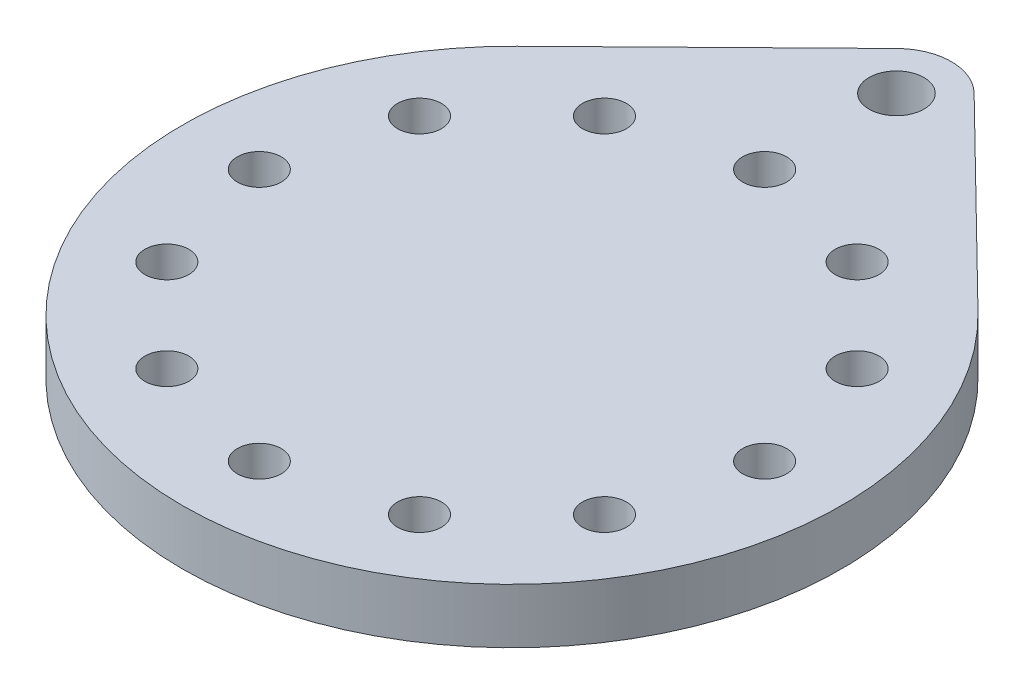
ISO-10303-21;
HEADER;
FILE_DESCRIPTION(('STEP AP214'),'2;1');
FILE_NAME('part.step','',(''),(''),'','','');
FILE_SCHEMA(('AUTOMOTIVE_DESIGN { 1 0 10303 214 1 1 1 1 }'));
ENDSEC;
DATA;
#1=APPLICATION_CONTEXT('core data for automotive mechanical design processes');
#2=APPLICATION_PROTOCOL_DEFINITION('international standard','automotive_design',2000,#1);
#3=PRODUCT_CONTEXT('',#1,'mechanical');
#4=PRODUCT('Part','Part','',(#3));
#5=PRODUCT_RELATED_PRODUCT_CATEGORY('part','',(#4));
#6=PRODUCT_DEFINITION_FORMATION('','',#4);
#7=PRODUCT_DEFINITION_CONTEXT('part definition',#1,'design');
#8=PRODUCT_DEFINITION('design','',#6,#7);
#9=PRODUCT_DEFINITION_SHAPE('','',#8);
#10=(LENGTH_UNIT() NAMED_UNIT(*) SI_UNIT(.MILLI.,.METRE.));
#11=(NAMED_UNIT(*) PLANE_ANGLE_UNIT() SI_UNIT($,.RADIAN.));
#12=(NAMED_UNIT(*) SI_UNIT($,.STERADIAN.) SOLID_ANGLE_UNIT());
#13=UNCERTAINTY_MEASURE_WITH_UNIT(LENGTH_MEASURE(1.E-05),#10,'distance_accuracy_value','');
#14=(GEOMETRIC_REPRESENTATION_CONTEXT(3) GLOBAL_UNCERTAINTY_ASSIGNED_CONTEXT((#13)) GLOBAL_UNIT_ASSIGNED_CONTEXT((#10,
#11,#12)) REPRESENTATION_CONTEXT('',''));
#15=CARTESIAN_POINT('',(0.,0.,0.));
#16=DIRECTION('',(0.,0.,1.));
#17=DIRECTION('',(1.,0.,0.));
#18=AXIS2_PLACEMENT_3D('',#15,#16,#17);
#19=CARTESIAN_POINT('',(0.,5.,0.));
#20=DIRECTION('',(0.,-1.,0.));
#21=DIRECTION('',(0.,0.,-1.));
#22=AXIS2_PLACEMENT_3D('',#19,#20,#21);
#23=CYLINDRICAL_SURFACE('',#22,30.);
#24=CARTESIAN_POINT('',(0.,0.,0.));
#25=DIRECTION('',(0.,1.,0.));
#26=DIRECTION('',(0.,0.,1.));
#27=AXIS2_PLACEMENT_3D('',#24,#25,#26);
#28=CIRCLE('',#27,30.);
#29=CARTESIAN_POINT('',(-20.995626366713,0.,-21.4285714285714));
#30=VERTEX_POINT('',#29);
#31=CARTESIAN_POINT('',(20.995626366713,0.,-21.4285714285714));
#32=VERTEX_POINT('',#31);
#33=EDGE_CURVE('E143',#30,#32,#28,.T.);
#34=ORIENTED_EDGE('',*,*,#33,.T.);
#35=DIRECTION('',(0.,-1.,0.));
#36=VECTOR('',#35,1.);
#37=CARTESIAN_POINT('',(20.995626366713,5.,-21.4285714285714));
#38=LINE('',#37,#36);
#39=CARTESIAN_POINT('',(20.995626366713,5.,-21.4285714285714));
#40=VERTEX_POINT('',#39);
#41=EDGE_CURVE('E11',#40,#32,#38,.T.);
#42=ORIENTED_EDGE('',*,*,#41,.F.);
#43=CARTESIAN_POINT('',(0.,5.,0.));
#44=DIRECTION('',(0.,1.,0.));
#45=DIRECTION('',(0.,0.,1.));
#46=AXIS2_PLACEMENT_3D('',#43,#44,#45);
#47=CIRCLE('',#46,30.);
#48=CARTESIAN_POINT('',(-20.995626366713,5.,-21.4285714285714));
#49=VERTEX_POINT('',#48);
#50=EDGE_CURVE('E80',#49,#40,#47,.T.);
#51=ORIENTED_EDGE('',*,*,#50,.F.);
#52=DIRECTION('',(0.,-1.,0.));
#53=VECTOR('',#52,1.);
#54=CARTESIAN_POINT('',(-20.995626366713,5.,-21.4285714285714));
#55=LINE('',#54,#53);
#56=EDGE_CURVE('E106',#49,#30,#55,.T.);
#57=ORIENTED_EDGE('',*,*,#56,.T.);
#58=EDGE_LOOP('',(#34,#42,#51,#57));
#59=FACE_BOUND('',#58,.T.);
#60=ADVANCED_FACE('F37',(#59),#23,.T.);
#61=CARTESIAN_POINT('',(20.995626366713,5.,-21.4285714285714));
#62=DIRECTION('',(0.699854212223765,0.,-0.714285714285714));
#63=DIRECTION('',(-0.714285714285714,0.,-0.699854212223765));
#64=AXIS2_PLACEMENT_3D('',#61,#62,#63);
#65=PLANE('',#64);
#66=DIRECTION('',(0.714285714285714,0.,0.699854212223766));
#67=VECTOR('',#66,1.);
#68=CARTESIAN_POINT('',(20.995626366713,0.,-21.4285714285714));
#69=LINE('',#68,#67);
#70=CARTESIAN_POINT('',(3.49927106111883,0.,-38.5714285714286));
#71=VERTEX_POINT('',#70);
#72=EDGE_CURVE('E90',#71,#32,#69,.T.);
#73=ORIENTED_EDGE('',*,*,#72,.F.);
#74=DIRECTION('',(0.,-1.,0.));
#75=VECTOR('',#74,1.);
#76=CARTESIAN_POINT('',(3.49927106111883,5.,-38.5714285714286));
#77=LINE('',#76,#75);
#78=CARTESIAN_POINT('',(3.49927106111883,5.,-38.5714285714286));
#79=VERTEX_POINT('',#78);
#80=EDGE_CURVE('E46',#79,#71,#77,.T.);
#81=ORIENTED_EDGE('',*,*,#80,.F.);
#82=DIRECTION('',(0.714285714285714,0.,0.699854212223766));
#83=VECTOR('',#82,1.);
#84=CARTESIAN_POINT('',(20.995626366713,5.,-21.4285714285714));
#85=LINE('',#84,#83);
#86=EDGE_CURVE('E88',#79,#40,#85,.T.);
#87=ORIENTED_EDGE('',*,*,#86,.T.);
#88=ORIENTED_EDGE('',*,*,#41,.T.);
#89=EDGE_LOOP('',(#73,#81,#87,#88));
#90=FACE_BOUND('',#89,.T.);
#91=ADVANCED_FACE('F87',(#90),#65,.T.);
#92=CARTESIAN_POINT('',(0.,5.,-35.));
#93=DIRECTION('',(0.,-1.,0.));
#94=DIRECTION('',(0.,0.,-1.));
#95=AXIS2_PLACEMENT_3D('',#92,#93,#94);
#96=CYLINDRICAL_SURFACE('',#95,5.00000000000001);
#97=CARTESIAN_POINT('',(0.,0.,-35.));
#98=DIRECTION('',(0.,1.,0.));
#99=DIRECTION('',(0.,0.,1.));
#100=AXIS2_PLACEMENT_3D('',#97,#98,#99);
#101=CIRCLE('',#100,5.00000000000001);
#102=CARTESIAN_POINT('',(-3.49927106111883,0.,-38.5714285714286));
#103=VERTEX_POINT('',#102);
#104=EDGE_CURVE('E69',#71,#103,#101,.T.);
#105=ORIENTED_EDGE('',*,*,#104,.T.);
#106=DIRECTION('',(0.,-1.,0.));
#107=VECTOR('',#106,1.);
#108=CARTESIAN_POINT('',(-3.49927106111883,5.,-38.5714285714286));
#109=LINE('',#108,#107);
#110=CARTESIAN_POINT('',(-3.49927106111883,5.,-38.5714285714286));
#111=VERTEX_POINT('',#110);
#112=EDGE_CURVE('E91',#111,#103,#109,.T.);
#113=ORIENTED_EDGE('',*,*,#112,.F.);
#114=CARTESIAN_POINT('',(0.,5.,-35.));
#115=DIRECTION('',(0.,1.,0.));
#116=DIRECTION('',(0.,0.,1.));
#117=AXIS2_PLACEMENT_3D('',#114,#115,#116);
#118=CIRCLE('',#117,5.00000000000001);
#119=EDGE_CURVE('E92',#79,#111,#118,.T.);
#120=ORIENTED_EDGE('',*,*,#119,.F.);
#121=ORIENTED_EDGE('',*,*,#80,.T.);
#122=EDGE_LOOP('',(#105,#113,#120,#121));
#123=FACE_BOUND('',#122,.T.);
#124=ADVANCED_FACE('F93',(#123),#96,.T.);
#125=CARTESIAN_POINT('',(-20.995626366713,5.,-21.4285714285714));
#126=DIRECTION('',(0.699854212223765,0.,0.714285714285714));
#127=DIRECTION('',(0.714285714285714,0.,-0.699854212223765));
#128=AXIS2_PLACEMENT_3D('',#125,#126,#127);
#129=PLANE('',#128);
#130=DIRECTION('',(-0.714285714285714,0.,0.699854212223765));
#131=VECTOR('',#130,1.);
#132=CARTESIAN_POINT('',(-20.995626366713,0.,-21.4285714285714));
#133=LINE('',#132,#131);
#134=EDGE_CURVE('E75',#103,#30,#133,.T.);
#135=ORIENTED_EDGE('',*,*,#134,.T.);
#136=ORIENTED_EDGE('',*,*,#56,.F.);
#137=DIRECTION('',(-0.714285714285714,0.,0.699854212223765));
#138=VECTOR('',#137,1.);
#139=CARTESIAN_POINT('',(-20.995626366713,5.,-21.4285714285714));
#140=LINE('',#139,#138);
#141=EDGE_CURVE('E54',#111,#49,#140,.T.);
#142=ORIENTED_EDGE('',*,*,#141,.F.);
#143=ORIENTED_EDGE('',*,*,#112,.T.);
#144=EDGE_LOOP('',(#135,#136,#142,#143));
#145=FACE_BOUND('',#144,.T.);
#146=ADVANCED_FACE('F154',(#145),#129,.F.);
#147=CARTESIAN_POINT('',(0.,5.,-23.));
#148=DIRECTION('',(0.,-1.,0.));
#149=DIRECTION('',(0.,0.,-1.));
#150=AXIS2_PLACEMENT_3D('',#147,#148,#149);
#151=CYLINDRICAL_SURFACE('',#150,2.);
#152=CARTESIAN_POINT('',(0.,5.,-23.));
#153=DIRECTION('',(0.,1.,0.));
#154=DIRECTION('',(0.,0.,1.));
#155=AXIS2_PLACEMENT_3D('',#152,#153,#154);
#156=CIRCLE('',#155,2.);
#157=CARTESIAN_POINT('',(0.,5.,-21.));
#158=VERTEX_POINT('',#157);
#159=EDGE_CURVE('E98',#158,#158,#156,.T.);
#160=ORIENTED_EDGE('',*,*,#159,.T.);
#161=EDGE_LOOP('',(#160));
#162=FACE_BOUND('',#161,.T.);
#163=CARTESIAN_POINT('',(0.,0.,-23.));
#164=DIRECTION('',(0.,1.,0.));
#165=DIRECTION('',(0.,0.,1.));
#166=AXIS2_PLACEMENT_3D('',#163,#164,#165);
#167=CIRCLE('',#166,2.);
#168=CARTESIAN_POINT('',(0.,0.,-21.));
#169=VERTEX_POINT('',#168);
#170=EDGE_CURVE('E140',#169,#169,#167,.T.);
#171=ORIENTED_EDGE('',*,*,#170,.F.);
#172=EDGE_LOOP('',(#171));
#173=FACE_BOUND('',#172,.T.);
#174=ADVANCED_FACE('F168',(#162,#173),#151,.F.);
#175=CARTESIAN_POINT('',(11.5,5.,-19.9185842870421));
#176=DIRECTION('',(0.,-1.,0.));
#177=DIRECTION('',(0.,0.,-1.));
#178=AXIS2_PLACEMENT_3D('',#175,#176,#177);
#179=CYLINDRICAL_SURFACE('',#178,2.);
#180=CARTESIAN_POINT('',(11.5,5.,-19.9185842870421));
#181=DIRECTION('',(0.,1.,0.));
#182=DIRECTION('',(0.,0.,1.));
#183=AXIS2_PLACEMENT_3D('',#180,#181,#182);
#184=CIRCLE('',#183,2.);
#185=CARTESIAN_POINT('',(11.5,5.,-17.9185842870421));
#186=VERTEX_POINT('',#185);
#187=EDGE_CURVE('E435',#186,#186,#184,.T.);
#188=ORIENTED_EDGE('',*,*,#187,.T.);
#189=EDGE_LOOP('',(#188));
#190=FACE_BOUND('',#189,.T.);
#191=CARTESIAN_POINT('',(11.5,0.,-19.9185842870421));
#192=DIRECTION('',(0.,1.,0.));
#193=DIRECTION('',(0.,0.,1.));
#194=AXIS2_PLACEMENT_3D('',#191,#192,#193);
#195=CIRCLE('',#194,2.);
#196=CARTESIAN_POINT('',(11.5,0.,-17.9185842870421));
#197=VERTEX_POINT('',#196);
#198=EDGE_CURVE('E137',#197,#197,#195,.T.);
#199=ORIENTED_EDGE('',*,*,#198,.F.);
#200=EDGE_LOOP('',(#199));
#201=FACE_BOUND('',#200,.T.);
#202=ADVANCED_FACE('F171',(#190,#201),#179,.F.);
#203=CARTESIAN_POINT('',(19.9185842870426,5.,-11.5000000000008));
#204=DIRECTION('',(0.,-1.,0.));
#205=DIRECTION('',(0.,0.,-1.));
#206=AXIS2_PLACEMENT_3D('',#203,#204,#205);
#207=CYLINDRICAL_SURFACE('',#206,2.00000000000027);
#208=CARTESIAN_POINT('',(19.9185842870426,5.,-11.5000000000008));
#209=DIRECTION('',(0.,1.,0.));
#210=DIRECTION('',(0.,0.,1.));
#211=AXIS2_PLACEMENT_3D('',#208,#209,#210);
#212=CIRCLE('',#211,2.00000000000027);
#213=CARTESIAN_POINT('',(19.9185842870426,5.,-9.50000000000058));
#214=VERTEX_POINT('',#213);
#215=EDGE_CURVE('E431',#214,#214,#212,.T.);
#216=ORIENTED_EDGE('',*,*,#215,.T.);
#217=EDGE_LOOP('',(#216));
#218=FACE_BOUND('',#217,.T.);
#219=CARTESIAN_POINT('',(19.9185842870426,0.,-11.5000000000008));
#220=DIRECTION('',(0.,1.,0.));
#221=DIRECTION('',(0.,0.,1.));
#222=AXIS2_PLACEMENT_3D('',#219,#220,#221);
#223=CIRCLE('',#222,2.00000000000027);
#224=CARTESIAN_POINT('',(19.9185842870426,0.,-9.50000000000058));
#225=VERTEX_POINT('',#224);
#226=EDGE_CURVE('E134',#225,#225,#223,.T.);
#227=ORIENTED_EDGE('',*,*,#226,.F.);
#228=EDGE_LOOP('',(#227));
#229=FACE_BOUND('',#228,.T.);
#230=ADVANCED_FACE('F175',(#218,#229),#207,.F.);
#231=CARTESIAN_POINT('',(23.000000000001,5.,-9.7632394389188E-13));
#232=DIRECTION('',(0.,-1.,0.));
#233=DIRECTION('',(0.,0.,-1.));
#234=AXIS2_PLACEMENT_3D('',#231,#232,#233);
#235=CYLINDRICAL_SURFACE('',#234,2.00000000000073);
#236=CARTESIAN_POINT('',(23.000000000001,5.,-9.7632394389188E-13));
#237=DIRECTION('',(0.,1.,0.));
#238=DIRECTION('',(0.,0.,1.));
#239=AXIS2_PLACEMENT_3D('',#236,#237,#238);
#240=CIRCLE('',#239,2.00000000000073);
#241=CARTESIAN_POINT('',(23.000000000001,5.,1.99999999999975));
#242=VERTEX_POINT('',#241);
#243=EDGE_CURVE('E427',#242,#242,#240,.T.);
#244=ORIENTED_EDGE('',*,*,#243,.T.);
#245=EDGE_LOOP('',(#244));
#246=FACE_BOUND('',#245,.T.);
#247=CARTESIAN_POINT('',(23.000000000001,0.,-9.7632394389188E-13));
#248=DIRECTION('',(0.,1.,0.));
#249=DIRECTION('',(0.,0.,1.));
#250=AXIS2_PLACEMENT_3D('',#247,#248,#249);
#251=CIRCLE('',#250,2.00000000000073);
#252=CARTESIAN_POINT('',(23.000000000001,0.,1.99999999999975));
#253=VERTEX_POINT('',#252);
#254=EDGE_CURVE('E131',#253,#253,#251,.T.);
#255=ORIENTED_EDGE('',*,*,#254,.F.);
#256=EDGE_LOOP('',(#255));
#257=FACE_BOUND('',#256,.T.);
#258=ADVANCED_FACE('F179',(#246,#257),#235,.F.);
#259=CARTESIAN_POINT('',(19.9185842870436,5.,11.4999999999992));
#260=DIRECTION('',(0.,-1.,0.));
#261=DIRECTION('',(0.,0.,-1.));
#262=AXIS2_PLACEMENT_3D('',#259,#260,#261);
#263=CYLINDRICAL_SURFACE('',#262,2.00000000000126);
#264=CARTESIAN_POINT('',(19.9185842870436,5.,11.4999999999992));
#265=DIRECTION('',(0.,1.,0.));
#266=DIRECTION('',(0.,0.,1.));
#267=AXIS2_PLACEMENT_3D('',#264,#265,#266);
#268=CIRCLE('',#267,2.00000000000126);
#269=CARTESIAN_POINT('',(19.9185842870436,5.,13.5000000000004));
#270=VERTEX_POINT('',#269);
#271=EDGE_CURVE('E423',#270,#270,#268,.T.);
#272=ORIENTED_EDGE('',*,*,#271,.T.);
#273=EDGE_LOOP('',(#272));
#274=FACE_BOUND('',#273,.T.);
#275=CARTESIAN_POINT('',(19.9185842870436,0.,11.4999999999992));
#276=DIRECTION('',(0.,1.,0.));
#277=DIRECTION('',(0.,0.,1.));
#278=AXIS2_PLACEMENT_3D('',#275,#276,#277);
#279=CIRCLE('',#278,2.00000000000126);
#280=CARTESIAN_POINT('',(19.9185842870436,0.,13.5000000000004));
#281=VERTEX_POINT('',#280);
#282=EDGE_CURVE('E128',#281,#281,#279,.T.);
#283=ORIENTED_EDGE('',*,*,#282,.F.);
#284=EDGE_LOOP('',(#283));
#285=FACE_BOUND('',#284,.T.);
#286=ADVANCED_FACE('F183',(#274,#285),#263,.F.);
#287=CARTESIAN_POINT('',(11.5000000000018,5.,19.9185842870416));
#288=DIRECTION('',(0.,-1.,0.));
#289=DIRECTION('',(0.,0.,-1.));
#290=AXIS2_PLACEMENT_3D('',#287,#288,#289);
#291=CYLINDRICAL_SURFACE('',#290,2.00000000000174);
#292=CARTESIAN_POINT('',(11.5000000000018,5.,19.9185842870416));
#293=DIRECTION('',(0.,1.,0.));
#294=DIRECTION('',(0.,0.,1.));
#295=AXIS2_PLACEMENT_3D('',#292,#293,#294);
#296=CIRCLE('',#295,2.00000000000174);
#297=CARTESIAN_POINT('',(11.5000000000018,5.,21.9185842870433));
#298=VERTEX_POINT('',#297);
#299=EDGE_CURVE('E419',#298,#298,#296,.T.);
#300=ORIENTED_EDGE('',*,*,#299,.T.);
#301=EDGE_LOOP('',(#300));
#302=FACE_BOUND('',#301,.T.);
#303=CARTESIAN_POINT('',(11.5000000000018,0.,19.9185842870416));
#304=DIRECTION('',(0.,1.,0.));
#305=DIRECTION('',(0.,0.,1.));
#306=AXIS2_PLACEMENT_3D('',#303,#304,#305);
#307=CIRCLE('',#306,2.00000000000174);
#308=CARTESIAN_POINT('',(11.5000000000018,0.,21.9185842870433));
#309=VERTEX_POINT('',#308);
#310=EDGE_CURVE('E125',#309,#309,#307,.T.);
#311=ORIENTED_EDGE('',*,*,#310,.F.);
#312=EDGE_LOOP('',(#311));
#313=FACE_BOUND('',#312,.T.);
#314=ADVANCED_FACE('F187',(#302,#313),#291,.F.);
#315=CARTESIAN_POINT('',(1.95264788778376E-12,5.,23.));
#316=DIRECTION('',(0.,-1.,0.));
#317=DIRECTION('',(0.,0.,-1.));
#318=AXIS2_PLACEMENT_3D('',#315,#316,#317);
#319=CYLINDRICAL_SURFACE('',#318,2.00000000000202);
#320=CARTESIAN_POINT('',(1.95264788778376E-12,5.,23.));
#321=DIRECTION('',(0.,1.,0.));
#322=DIRECTION('',(0.,0.,1.));
#323=AXIS2_PLACEMENT_3D('',#320,#321,#322);
#324=CIRCLE('',#323,2.00000000000202);
#325=CARTESIAN_POINT('',(1.95264788778376E-12,5.,25.000000000002));
#326=VERTEX_POINT('',#325);
#327=EDGE_CURVE('E415',#326,#326,#324,.T.);
#328=ORIENTED_EDGE('',*,*,#327,.T.);
#329=EDGE_LOOP('',(#328));
#330=FACE_BOUND('',#329,.T.);
#331=CARTESIAN_POINT('',(1.95264788778376E-12,0.,23.));
#332=DIRECTION('',(0.,1.,0.));
#333=DIRECTION('',(0.,0.,1.));
#334=AXIS2_PLACEMENT_3D('',#331,#332,#333);
#335=CIRCLE('',#334,2.00000000000202);
#336=CARTESIAN_POINT('',(1.95264788778376E-12,0.,25.000000000002));
#337=VERTEX_POINT('',#336);
#338=EDGE_CURVE('E122',#337,#337,#335,.T.);
#339=ORIENTED_EDGE('',*,*,#338,.F.);
#340=EDGE_LOOP('',(#339));
#341=FACE_BOUND('',#340,.T.);
#342=ADVANCED_FACE('F191',(#330,#341),#319,.F.);
#343=CARTESIAN_POINT('',(-11.4999999999982,5.,19.9185842870426));
#344=DIRECTION('',(0.,-1.,0.));
#345=DIRECTION('',(0.,0.,-1.));
#346=AXIS2_PLACEMENT_3D('',#343,#344,#345);
#347=CYLINDRICAL_SURFACE('',#346,2.00000000000207);
#348=CARTESIAN_POINT('',(-11.4999999999982,5.,19.9185842870426));
#349=DIRECTION('',(0.,1.,0.));
#350=DIRECTION('',(0.,0.,1.));
#351=AXIS2_PLACEMENT_3D('',#348,#349,#350);
#352=CIRCLE('',#351,2.00000000000207);
#353=CARTESIAN_POINT('',(-11.4999999999982,5.,21.9185842870447));
#354=VERTEX_POINT('',#353);
#355=EDGE_CURVE('E411',#354,#354,#352,.T.);
#356=ORIENTED_EDGE('',*,*,#355,.T.);
#357=EDGE_LOOP('',(#356));
#358=FACE_BOUND('',#357,.T.);
#359=CARTESIAN_POINT('',(-11.4999999999982,0.,19.9185842870426));
#360=DIRECTION('',(0.,1.,0.));
#361=DIRECTION('',(0.,0.,1.));
#362=AXIS2_PLACEMENT_3D('',#359,#360,#361);
#363=CIRCLE('',#362,2.00000000000207);
#364=CARTESIAN_POINT('',(-11.4999999999982,0.,21.9185842870447));
#365=VERTEX_POINT('',#364);
#366=EDGE_CURVE('E119',#365,#365,#363,.T.);
#367=ORIENTED_EDGE('',*,*,#366,.F.);
#368=EDGE_LOOP('',(#367));
#369=FACE_BOUND('',#368,.T.);
#370=ADVANCED_FACE('F195',(#358,#369),#347,.F.);
#371=CARTESIAN_POINT('',(-19.9185842870406,5.,11.5000000000009));
#372=DIRECTION('',(0.,-1.,0.));
#373=DIRECTION('',(0.,0.,-1.));
#374=AXIS2_PLACEMENT_3D('',#371,#372,#373);
#375=CYLINDRICAL_SURFACE('',#374,2.00000000000186);
#376=CARTESIAN_POINT('',(-19.9185842870406,5.,11.5000000000009));
#377=DIRECTION('',(0.,1.,0.));
#378=DIRECTION('',(0.,0.,1.));
#379=AXIS2_PLACEMENT_3D('',#376,#377,#378);
#380=CIRCLE('',#379,2.00000000000186);
#381=CARTESIAN_POINT('',(-19.9185842870406,5.,13.5000000000027));
#382=VERTEX_POINT('',#381);
#383=EDGE_CURVE('E407',#382,#382,#380,.T.);
#384=ORIENTED_EDGE('',*,*,#383,.T.);
#385=EDGE_LOOP('',(#384));
#386=FACE_BOUND('',#385,.T.);
#387=CARTESIAN_POINT('',(-19.9185842870406,0.,11.5000000000009));
#388=DIRECTION('',(0.,1.,0.));
#389=DIRECTION('',(0.,0.,1.));
#390=AXIS2_PLACEMENT_3D('',#387,#388,#389);
#391=CIRCLE('',#390,2.00000000000186);
#392=CARTESIAN_POINT('',(-19.9185842870406,0.,13.5000000000027));
#393=VERTEX_POINT('',#392);
#394=EDGE_CURVE('E116',#393,#393,#391,.T.);
#395=ORIENTED_EDGE('',*,*,#394,.F.);
#396=EDGE_LOOP('',(#395));
#397=FACE_BOUND('',#396,.T.);
#398=ADVANCED_FACE('F199',(#386,#397),#375,.F.);
#399=CARTESIAN_POINT('',(-22.999999999999,5.,9.79140631529919E-13));
#400=DIRECTION('',(0.,-1.,0.));
#401=DIRECTION('',(0.,0.,-1.));
#402=AXIS2_PLACEMENT_3D('',#399,#400,#401);
#403=CYLINDRICAL_SURFACE('',#402,2.00000000000145);
#404=CARTESIAN_POINT('',(-22.999999999999,5.,9.79140631529919E-13));
#405=DIRECTION('',(0.,1.,0.));
#406=DIRECTION('',(0.,0.,1.));
#407=AXIS2_PLACEMENT_3D('',#404,#405,#406);
#408=CIRCLE('',#407,2.00000000000145);
#409=CARTESIAN_POINT('',(-22.999999999999,5.,2.00000000000243));
#410=VERTEX_POINT('',#409);
#411=EDGE_CURVE('E403',#410,#410,#408,.T.);
#412=ORIENTED_EDGE('',*,*,#411,.T.);
#413=EDGE_LOOP('',(#412));
#414=FACE_BOUND('',#413,.T.);
#415=CARTESIAN_POINT('',(-22.999999999999,0.,9.79140631529919E-13));
#416=DIRECTION('',(0.,1.,0.));
#417=DIRECTION('',(0.,0.,1.));
#418=AXIS2_PLACEMENT_3D('',#415,#416,#417);
#419=CIRCLE('',#418,2.00000000000145);
#420=CARTESIAN_POINT('',(-22.999999999999,0.,2.00000000000243));
#421=VERTEX_POINT('',#420);
#422=EDGE_CURVE('E113',#421,#421,#419,.T.);
#423=ORIENTED_EDGE('',*,*,#422,.F.);
#424=EDGE_LOOP('',(#423));
#425=FACE_BOUND('',#424,.T.);
#426=ADVANCED_FACE('F203',(#414,#425),#403,.F.);
#427=CARTESIAN_POINT('',(-19.9185842870416,5.,-11.4999999999991));
#428=DIRECTION('',(0.,-1.,0.));
#429=DIRECTION('',(0.,0.,-1.));
#430=AXIS2_PLACEMENT_3D('',#427,#428,#429);
#431=CYLINDRICAL_SURFACE('',#430,2.00000000000099);
#432=CARTESIAN_POINT('',(-19.9185842870416,5.,-11.4999999999991));
#433=DIRECTION('',(0.,1.,0.));
#434=DIRECTION('',(0.,0.,1.));
#435=AXIS2_PLACEMENT_3D('',#432,#433,#434);
#436=CIRCLE('',#435,2.00000000000099);
#437=CARTESIAN_POINT('',(-19.9185842870416,5.,-9.49999999999815));
#438=VERTEX_POINT('',#437);
#439=EDGE_CURVE('E218',#438,#438,#436,.T.);
#440=ORIENTED_EDGE('',*,*,#439,.T.);
#441=EDGE_LOOP('',(#440));
#442=FACE_BOUND('',#441,.T.);
#443=CARTESIAN_POINT('',(-19.9185842870416,0.,-11.4999999999991));
#444=DIRECTION('',(0.,1.,0.));
#445=DIRECTION('',(0.,0.,1.));
#446=AXIS2_PLACEMENT_3D('',#443,#444,#445);
#447=CIRCLE('',#446,2.00000000000099);
#448=CARTESIAN_POINT('',(-19.9185842870416,0.,-9.49999999999815));
#449=VERTEX_POINT('',#448);
#450=EDGE_CURVE('E110',#449,#449,#447,.T.);
#451=ORIENTED_EDGE('',*,*,#450,.F.);
#452=EDGE_LOOP('',(#451));
#453=FACE_BOUND('',#452,.T.);
#454=ADVANCED_FACE('F206',(#442,#453),#431,.F.);
#455=CARTESIAN_POINT('',(-11.4999999999997,5.,-19.9185842870422));
#456=DIRECTION('',(0.,-1.,0.));
#457=DIRECTION('',(0.,0.,-1.));
#458=AXIS2_PLACEMENT_3D('',#455,#456,#457);
#459=CYLINDRICAL_SURFACE('',#458,2.);
#460=CARTESIAN_POINT('',(-11.4999999999997,5.,-19.9185842870422));
#461=DIRECTION('',(0.,1.,0.));
#462=DIRECTION('',(0.,0.,1.));
#463=AXIS2_PLACEMENT_3D('',#460,#461,#462);
#464=CIRCLE('',#463,2.);
#465=CARTESIAN_POINT('',(-11.4999999999997,5.,-17.9185842870422));
#466=VERTEX_POINT('',#465);
#467=EDGE_CURVE('E152',#466,#466,#464,.T.);
#468=ORIENTED_EDGE('',*,*,#467,.T.);
#469=EDGE_LOOP('',(#468));
#470=FACE_BOUND('',#469,.T.);
#471=CARTESIAN_POINT('',(-11.4999999999997,0.,-19.9185842870422));
#472=DIRECTION('',(0.,1.,0.));
#473=DIRECTION('',(0.,0.,1.));
#474=AXIS2_PLACEMENT_3D('',#471,#472,#473);
#475=CIRCLE('',#474,2.);
#476=CARTESIAN_POINT('',(-11.4999999999997,0.,-17.9185842870422));
#477=VERTEX_POINT('',#476);
#478=EDGE_CURVE('E107',#477,#477,#475,.T.);
#479=ORIENTED_EDGE('',*,*,#478,.F.);
#480=EDGE_LOOP('',(#479));
#481=FACE_BOUND('',#480,.T.);
#482=ADVANCED_FACE('F39',(#470,#481),#459,.F.);
#483=CARTESIAN_POINT('',(0.,5.,-35.));
#484=DIRECTION('',(0.,-1.,0.));
#485=DIRECTION('',(0.,0.,-1.));
#486=AXIS2_PLACEMENT_3D('',#483,#484,#485);
#487=CYLINDRICAL_SURFACE('',#486,2.5);
#488=CARTESIAN_POINT('',(0.,5.,-35.));
#489=DIRECTION('',(0.,1.,0.));
#490=DIRECTION('',(0.,0.,1.));
#491=AXIS2_PLACEMENT_3D('',#488,#489,#490);
#492=CIRCLE('',#491,2.5);
#493=CARTESIAN_POINT('',(0.,5.,-32.5));
#494=VERTEX_POINT('',#493);
#495=EDGE_CURVE('E103',#494,#494,#492,.T.);
#496=ORIENTED_EDGE('',*,*,#495,.T.);
#497=EDGE_LOOP('',(#496));
#498=FACE_BOUND('',#497,.T.);
#499=CARTESIAN_POINT('',(0.,0.,-35.));
#500=DIRECTION('',(0.,1.,0.));
#501=DIRECTION('',(0.,0.,1.));
#502=AXIS2_PLACEMENT_3D('',#499,#500,#501);
#503=CIRCLE('',#502,2.5);
#504=CARTESIAN_POINT('',(0.,0.,-32.5));
#505=VERTEX_POINT('',#504);
#506=EDGE_CURVE('E149',#505,#505,#503,.T.);
#507=ORIENTED_EDGE('',*,*,#506,.F.);
#508=EDGE_LOOP('',(#507));
#509=FACE_BOUND('',#508,.T.);
#510=ADVANCED_FACE('F213',(#498,#509),#487,.F.);
#511=CARTESIAN_POINT('',(0.,5.,0.));
#512=DIRECTION('',(0.,1.,0.));
#513=DIRECTION('',(0.,0.,1.));
#514=AXIS2_PLACEMENT_3D('',#511,#512,#513);
#515=PLANE('',#514);
#516=ORIENTED_EDGE('',*,*,#467,.F.);
#517=EDGE_LOOP('',(#516));
#518=FACE_BOUND('',#517,.T.);
#519=ORIENTED_EDGE('',*,*,#439,.F.);
#520=EDGE_LOOP('',(#519));
#521=FACE_BOUND('',#520,.T.);
#522=ORIENTED_EDGE('',*,*,#411,.F.);
#523=EDGE_LOOP('',(#522));
#524=FACE_BOUND('',#523,.T.);
#525=ORIENTED_EDGE('',*,*,#383,.F.);
#526=EDGE_LOOP('',(#525));
#527=FACE_BOUND('',#526,.T.);
#528=ORIENTED_EDGE('',*,*,#355,.F.);
#529=EDGE_LOOP('',(#528));
#530=FACE_BOUND('',#529,.T.);
#531=ORIENTED_EDGE('',*,*,#327,.F.);
#532=EDGE_LOOP('',(#531));
#533=FACE_BOUND('',#532,.T.);
#534=ORIENTED_EDGE('',*,*,#299,.F.);
#535=EDGE_LOOP('',(#534));
#536=FACE_BOUND('',#535,.T.);
#537=ORIENTED_EDGE('',*,*,#271,.F.);
#538=EDGE_LOOP('',(#537));
#539=FACE_BOUND('',#538,.T.);
#540=ORIENTED_EDGE('',*,*,#243,.F.);
#541=EDGE_LOOP('',(#540));
#542=FACE_BOUND('',#541,.T.);
#543=ORIENTED_EDGE('',*,*,#215,.F.);
#544=EDGE_LOOP('',(#543));
#545=FACE_BOUND('',#544,.T.);
#546=ORIENTED_EDGE('',*,*,#187,.F.);
#547=EDGE_LOOP('',(#546));
#548=FACE_BOUND('',#547,.T.);
#549=ORIENTED_EDGE('',*,*,#159,.F.);
#550=EDGE_LOOP('',(#549));
#551=FACE_BOUND('',#550,.T.);
#552=ORIENTED_EDGE('',*,*,#50,.T.);
#553=ORIENTED_EDGE('',*,*,#86,.F.);
#554=ORIENTED_EDGE('',*,*,#119,.T.);
#555=ORIENTED_EDGE('',*,*,#141,.T.);
#556=EDGE_LOOP('',(#552,#553,#554,#555));
#557=FACE_BOUND('',#556,.T.);
#558=ORIENTED_EDGE('',*,*,#495,.F.);
#559=EDGE_LOOP('',(#558));
#560=FACE_BOUND('',#559,.T.);
#561=ADVANCED_FACE('F95',(#518,#521,#524,#527,#530,#533,#536,#539,#542,#545,#548,#551,#557,
#560),#515,.T.);
#562=CARTESIAN_POINT('',(0.,0.,0.));
#563=DIRECTION('',(0.,1.,0.));
#564=DIRECTION('',(0.,0.,1.));
#565=AXIS2_PLACEMENT_3D('',#562,#563,#564);
#566=PLANE('',#565);
#567=ORIENTED_EDGE('',*,*,#478,.T.);
#568=EDGE_LOOP('',(#567));
#569=FACE_BOUND('',#568,.T.);
#570=ORIENTED_EDGE('',*,*,#450,.T.);
#571=EDGE_LOOP('',(#570));
#572=FACE_BOUND('',#571,.T.);
#573=ORIENTED_EDGE('',*,*,#422,.T.);
#574=EDGE_LOOP('',(#573));
#575=FACE_BOUND('',#574,.T.);
#576=ORIENTED_EDGE('',*,*,#394,.T.);
#577=EDGE_LOOP('',(#576));
#578=FACE_BOUND('',#577,.T.);
#579=ORIENTED_EDGE('',*,*,#366,.T.);
#580=EDGE_LOOP('',(#579));
#581=FACE_BOUND('',#580,.T.);
#582=ORIENTED_EDGE('',*,*,#338,.T.);
#583=EDGE_LOOP('',(#582));
#584=FACE_BOUND('',#583,.T.);
#585=ORIENTED_EDGE('',*,*,#310,.T.);
#586=EDGE_LOOP('',(#585));
#587=FACE_BOUND('',#586,.T.);
#588=ORIENTED_EDGE('',*,*,#282,.T.);
#589=EDGE_LOOP('',(#588));
#590=FACE_BOUND('',#589,.T.);
#591=ORIENTED_EDGE('',*,*,#254,.T.);
#592=EDGE_LOOP('',(#591));
#593=FACE_BOUND('',#592,.T.);
#594=ORIENTED_EDGE('',*,*,#226,.T.);
#595=EDGE_LOOP('',(#594));
#596=FACE_BOUND('',#595,.T.);
#597=ORIENTED_EDGE('',*,*,#198,.T.);
#598=EDGE_LOOP('',(#597));
#599=FACE_BOUND('',#598,.T.);
#600=ORIENTED_EDGE('',*,*,#170,.T.);
#601=EDGE_LOOP('',(#600));
#602=FACE_BOUND('',#601,.T.);
#603=ORIENTED_EDGE('',*,*,#33,.F.);
#604=ORIENTED_EDGE('',*,*,#134,.F.);
#605=ORIENTED_EDGE('',*,*,#104,.F.);
#606=ORIENTED_EDGE('',*,*,#72,.T.);
#607=EDGE_LOOP('',(#603,#604,#605,#606));
#608=FACE_BOUND('',#607,.T.);
#609=ORIENTED_EDGE('',*,*,#506,.T.);
#610=EDGE_LOOP('',(#609));
#611=FACE_BOUND('',#610,.T.);
#612=ADVANCED_FACE('F157',(#569,#572,#575,#578,#581,#584,#587,#590,#593,#596,#599,#602,#608,
#611),#566,.F.);
#613=CLOSED_SHELL('',(#60,#91,#124,#146,#174,#202,#230,#258,#286,#314,#342,#370,#398,#426,#454,
#482,#510,#561,#612));
#614=MANIFOLD_SOLID_BREP('B2',#613);
#615=ADVANCED_BREP_SHAPE_REPRESENTATION('',(#18,#614),#14);
#616=SHAPE_DEFINITION_REPRESENTATION(#9,#615);
ENDSEC;
END-ISO-10303-21;
